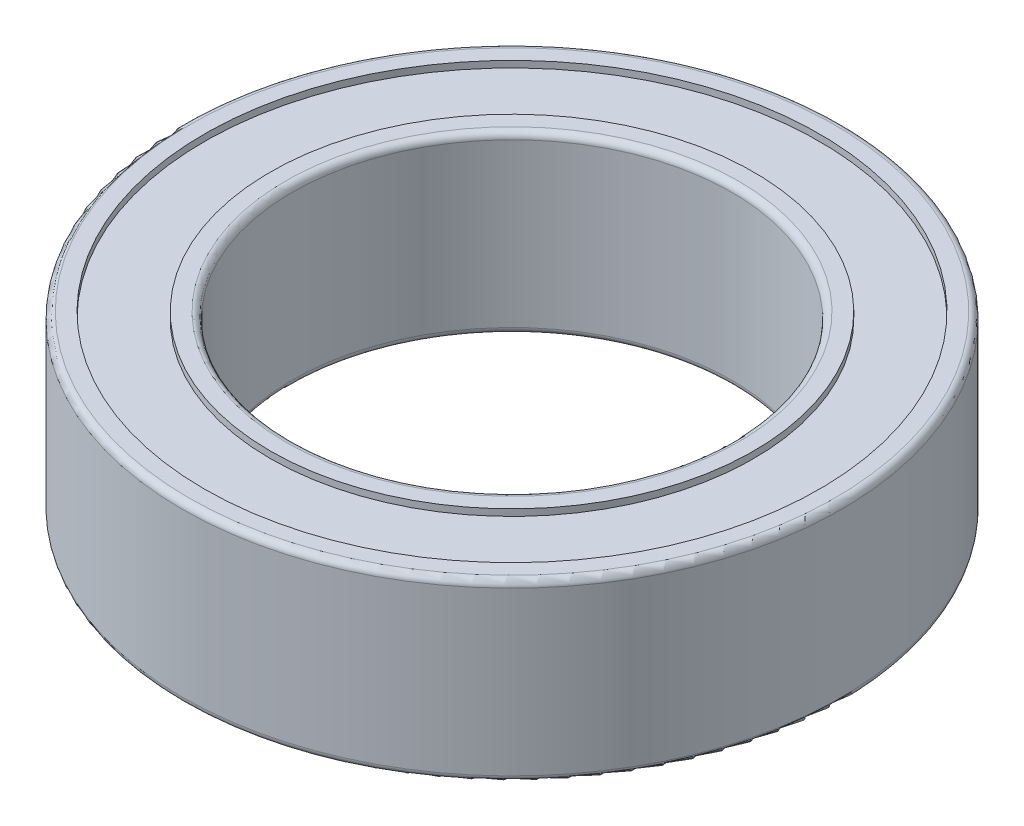
ISO-10303-21;
HEADER;
FILE_DESCRIPTION(('STEP AP214'),'2;1');
FILE_NAME('part.step','',(''),(''),'','','');
FILE_SCHEMA(('AUTOMOTIVE_DESIGN { 1 0 10303 214 1 1 1 1 }'));
ENDSEC;
DATA;
#1=APPLICATION_CONTEXT('core data for automotive mechanical design processes');
#2=APPLICATION_PROTOCOL_DEFINITION('international standard','automotive_design',2000,#1);
#3=PRODUCT_CONTEXT('',#1,'mechanical');
#4=PRODUCT('Part','Part','',(#3));
#5=PRODUCT_RELATED_PRODUCT_CATEGORY('part','',(#4));
#6=PRODUCT_DEFINITION_FORMATION('','',#4);
#7=PRODUCT_DEFINITION_CONTEXT('part definition',#1,'design');
#8=PRODUCT_DEFINITION('design','',#6,#7);
#9=PRODUCT_DEFINITION_SHAPE('','',#8);
#10=(LENGTH_UNIT() NAMED_UNIT(*) SI_UNIT(.MILLI.,.METRE.));
#11=(NAMED_UNIT(*) PLANE_ANGLE_UNIT() SI_UNIT($,.RADIAN.));
#12=(NAMED_UNIT(*) SI_UNIT($,.STERADIAN.) SOLID_ANGLE_UNIT());
#13=UNCERTAINTY_MEASURE_WITH_UNIT(LENGTH_MEASURE(1.E-05),#10,'distance_accuracy_value','');
#14=(GEOMETRIC_REPRESENTATION_CONTEXT(3) GLOBAL_UNCERTAINTY_ASSIGNED_CONTEXT((#13)) GLOBAL_UNIT_ASSIGNED_CONTEXT((#10,
#11,#12)) REPRESENTATION_CONTEXT('',''));
#15=CARTESIAN_POINT('',(0.,0.,0.));
#16=DIRECTION('',(0.,0.,1.));
#17=DIRECTION('',(1.,0.,0.));
#18=AXIS2_PLACEMENT_3D('',#15,#16,#17);
#19=CARTESIAN_POINT('',(0.,-1.85,0.));
#20=DIRECTION('',(0.,1.,0.));
#21=DIRECTION('',(0.,0.,1.));
#22=AXIS2_PLACEMENT_3D('',#19,#20,#21);
#23=TOROIDAL_SURFACE('',#22,5.15,0.15);
#24=CARTESIAN_POINT('',(0.,-1.85,0.));
#25=DIRECTION('',(0.,1.,0.));
#26=DIRECTION('',(0.,0.,1.));
#27=AXIS2_PLACEMENT_3D('',#24,#25,#26);
#28=CIRCLE('',#27,5.);
#29=CARTESIAN_POINT('',(0.,-1.85,5.));
#30=VERTEX_POINT('',#29);
#31=EDGE_CURVE('E10',#30,#30,#28,.T.);
#32=ORIENTED_EDGE('',*,*,#31,.T.);
#33=EDGE_LOOP('',(#32));
#34=FACE_BOUND('',#33,.T.);
#35=CARTESIAN_POINT('',(0.,-2.,0.));
#36=DIRECTION('',(0.,1.,0.));
#37=DIRECTION('',(0.,0.,1.));
#38=AXIS2_PLACEMENT_3D('',#35,#36,#37);
#39=CIRCLE('',#38,5.15);
#40=CARTESIAN_POINT('',(0.,-2.,5.15));
#41=VERTEX_POINT('',#40);
#42=EDGE_CURVE('E84',#41,#41,#39,.T.);
#43=ORIENTED_EDGE('',*,*,#42,.F.);
#44=EDGE_LOOP('',(#43));
#45=FACE_BOUND('',#44,.T.);
#46=ADVANCED_FACE('F32',(#34,#45),#23,.T.);
#47=CARTESIAN_POINT('',(0.,-2.00303108696888,0.));
#48=DIRECTION('',(0.,1.,0.));
#49=DIRECTION('',(0.,0.,1.));
#50=AXIS2_PLACEMENT_3D('',#47,#48,#49);
#51=CYLINDRICAL_SURFACE('',#50,5.);
#52=CARTESIAN_POINT('',(0.,1.85,0.));
#53=DIRECTION('',(0.,1.,0.));
#54=DIRECTION('',(0.,0.,1.));
#55=AXIS2_PLACEMENT_3D('',#52,#53,#54);
#56=CIRCLE('',#55,5.);
#57=CARTESIAN_POINT('',(0.,1.85,5.));
#58=VERTEX_POINT('',#57);
#59=EDGE_CURVE('E38',#58,#58,#56,.T.);
#60=ORIENTED_EDGE('',*,*,#59,.T.);
#61=EDGE_LOOP('',(#60));
#62=FACE_BOUND('',#61,.T.);
#63=ORIENTED_EDGE('',*,*,#31,.F.);
#64=EDGE_LOOP('',(#63));
#65=FACE_BOUND('',#64,.T.);
#66=ADVANCED_FACE('F92',(#62,#65),#51,.F.);
#67=CARTESIAN_POINT('',(0.,1.85,0.));
#68=DIRECTION('',(0.,1.,0.));
#69=DIRECTION('',(0.,0.,1.));
#70=AXIS2_PLACEMENT_3D('',#67,#68,#69);
#71=TOROIDAL_SURFACE('',#70,5.15,0.15);
#72=CARTESIAN_POINT('',(0.,2.,0.));
#73=DIRECTION('',(0.,1.,0.));
#74=DIRECTION('',(0.,0.,1.));
#75=AXIS2_PLACEMENT_3D('',#72,#73,#74);
#76=CIRCLE('',#75,5.15);
#77=CARTESIAN_POINT('',(0.,2.,5.15));
#78=VERTEX_POINT('',#77);
#79=EDGE_CURVE('E42',#78,#78,#76,.T.);
#80=ORIENTED_EDGE('',*,*,#79,.T.);
#81=EDGE_LOOP('',(#80));
#82=FACE_BOUND('',#81,.T.);
#83=ORIENTED_EDGE('',*,*,#59,.F.);
#84=EDGE_LOOP('',(#83));
#85=FACE_BOUND('',#84,.T.);
#86=ADVANCED_FACE('F96',(#82,#85),#71,.T.);
#87=CARTESIAN_POINT('',(5.15,2.,0.));
#88=DIRECTION('',(0.,1.,0.));
#89=DIRECTION('',(0.,0.,1.));
#90=AXIS2_PLACEMENT_3D('',#87,#88,#89);
#91=PLANE('',#90);
#92=CARTESIAN_POINT('',(0.,2.,0.));
#93=DIRECTION('',(0.,1.,0.));
#94=DIRECTION('',(0.,0.,1.));
#95=AXIS2_PLACEMENT_3D('',#92,#93,#94);
#96=CIRCLE('',#95,5.5);
#97=CARTESIAN_POINT('',(0.,2.,5.5));
#98=VERTEX_POINT('',#97);
#99=EDGE_CURVE('E46',#98,#98,#96,.T.);
#100=ORIENTED_EDGE('',*,*,#99,.T.);
#101=EDGE_LOOP('',(#100));
#102=FACE_BOUND('',#101,.T.);
#103=ORIENTED_EDGE('',*,*,#79,.F.);
#104=EDGE_LOOP('',(#103));
#105=FACE_BOUND('',#104,.T.);
#106=ADVANCED_FACE('F100',(#102,#105),#91,.T.);
#107=CARTESIAN_POINT('',(0.,-2.00303108696888,0.));
#108=DIRECTION('',(0.,1.,0.));
#109=DIRECTION('',(0.,0.,1.));
#110=AXIS2_PLACEMENT_3D('',#107,#108,#109);
#111=CYLINDRICAL_SURFACE('',#110,5.5);
#112=CARTESIAN_POINT('',(0.,1.85,0.));
#113=DIRECTION('',(0.,1.,0.));
#114=DIRECTION('',(0.,0.,1.));
#115=AXIS2_PLACEMENT_3D('',#112,#113,#114);
#116=CIRCLE('',#115,5.5);
#117=CARTESIAN_POINT('',(0.,1.85,5.5));
#118=VERTEX_POINT('',#117);
#119=EDGE_CURVE('E51',#118,#118,#116,.T.);
#120=ORIENTED_EDGE('',*,*,#119,.T.);
#121=EDGE_LOOP('',(#120));
#122=FACE_BOUND('',#121,.T.);
#123=ORIENTED_EDGE('',*,*,#99,.F.);
#124=EDGE_LOOP('',(#123));
#125=FACE_BOUND('',#124,.T.);
#126=ADVANCED_FACE('F107',(#122,#125),#111,.T.);
#127=CARTESIAN_POINT('',(5.5,1.85,0.));
#128=DIRECTION('',(0.,1.,0.));
#129=DIRECTION('',(0.,0.,1.));
#130=AXIS2_PLACEMENT_3D('',#127,#128,#129);
#131=PLANE('',#130);
#132=CARTESIAN_POINT('',(0.,1.85,0.));
#133=DIRECTION('',(0.,1.,0.));
#134=DIRECTION('',(0.,0.,1.));
#135=AXIS2_PLACEMENT_3D('',#132,#133,#134);
#136=CIRCLE('',#135,7.);
#137=CARTESIAN_POINT('',(0.,1.85,7.));
#138=VERTEX_POINT('',#137);
#139=EDGE_CURVE('E54',#138,#138,#136,.T.);
#140=ORIENTED_EDGE('',*,*,#139,.T.);
#141=EDGE_LOOP('',(#140));
#142=FACE_BOUND('',#141,.T.);
#143=ORIENTED_EDGE('',*,*,#119,.F.);
#144=EDGE_LOOP('',(#143));
#145=FACE_BOUND('',#144,.T.);
#146=ADVANCED_FACE('F111',(#142,#145),#131,.T.);
#147=CARTESIAN_POINT('',(0.,-2.00303108696888,0.));
#148=DIRECTION('',(0.,1.,0.));
#149=DIRECTION('',(0.,0.,1.));
#150=AXIS2_PLACEMENT_3D('',#147,#148,#149);
#151=CYLINDRICAL_SURFACE('',#150,7.);
#152=CARTESIAN_POINT('',(0.,2.,0.));
#153=DIRECTION('',(0.,1.,0.));
#154=DIRECTION('',(0.,0.,1.));
#155=AXIS2_PLACEMENT_3D('',#152,#153,#154);
#156=CIRCLE('',#155,7.);
#157=CARTESIAN_POINT('',(0.,2.,7.));
#158=VERTEX_POINT('',#157);
#159=EDGE_CURVE('E57',#158,#158,#156,.T.);
#160=ORIENTED_EDGE('',*,*,#159,.T.);
#161=EDGE_LOOP('',(#160));
#162=FACE_BOUND('',#161,.T.);
#163=ORIENTED_EDGE('',*,*,#139,.F.);
#164=EDGE_LOOP('',(#163));
#165=FACE_BOUND('',#164,.T.);
#166=ADVANCED_FACE('F115',(#162,#165),#151,.F.);
#167=CARTESIAN_POINT('',(7.,2.,0.));
#168=DIRECTION('',(0.,1.,0.));
#169=DIRECTION('',(0.,0.,1.));
#170=AXIS2_PLACEMENT_3D('',#167,#168,#169);
#171=PLANE('',#170);
#172=CARTESIAN_POINT('',(0.,2.,0.));
#173=DIRECTION('',(0.,1.,0.));
#174=DIRECTION('',(0.,0.,1.));
#175=AXIS2_PLACEMENT_3D('',#172,#173,#174);
#176=CIRCLE('',#175,7.35000000000007);
#177=CARTESIAN_POINT('',(0.,2.,7.35000000000007));
#178=VERTEX_POINT('',#177);
#179=EDGE_CURVE('E60',#178,#178,#176,.T.);
#180=ORIENTED_EDGE('',*,*,#179,.T.);
#181=EDGE_LOOP('',(#180));
#182=FACE_BOUND('',#181,.T.);
#183=ORIENTED_EDGE('',*,*,#159,.F.);
#184=EDGE_LOOP('',(#183));
#185=FACE_BOUND('',#184,.T.);
#186=ADVANCED_FACE('F119',(#182,#185),#171,.T.);
#187=CARTESIAN_POINT('',(0.,1.85,0.));
#188=DIRECTION('',(0.,1.,0.));
#189=DIRECTION('',(0.,0.,1.));
#190=AXIS2_PLACEMENT_3D('',#187,#188,#189);
#191=TOROIDAL_SURFACE('',#190,7.35,0.15);
#192=CARTESIAN_POINT('',(0.,1.85,0.));
#193=DIRECTION('',(0.,1.,0.));
#194=DIRECTION('',(0.,0.,1.));
#195=AXIS2_PLACEMENT_3D('',#192,#193,#194);
#196=CIRCLE('',#195,7.5);
#197=CARTESIAN_POINT('',(0.,1.85,7.5));
#198=VERTEX_POINT('',#197);
#199=EDGE_CURVE('E63',#198,#198,#196,.T.);
#200=ORIENTED_EDGE('',*,*,#199,.T.);
#201=EDGE_LOOP('',(#200));
#202=FACE_BOUND('',#201,.T.);
#203=ORIENTED_EDGE('',*,*,#179,.F.);
#204=EDGE_LOOP('',(#203));
#205=FACE_BOUND('',#204,.T.);
#206=ADVANCED_FACE('F123',(#202,#205),#191,.T.);
#207=CARTESIAN_POINT('',(0.,-2.00303108696888,0.));
#208=DIRECTION('',(0.,1.,0.));
#209=DIRECTION('',(0.,0.,1.));
#210=AXIS2_PLACEMENT_3D('',#207,#208,#209);
#211=CYLINDRICAL_SURFACE('',#210,7.5);
#212=CARTESIAN_POINT('',(0.,-1.85,0.));
#213=DIRECTION('',(0.,1.,0.));
#214=DIRECTION('',(0.,0.,1.));
#215=AXIS2_PLACEMENT_3D('',#212,#213,#214);
#216=CIRCLE('',#215,7.5);
#217=CARTESIAN_POINT('',(0.,-1.85,7.5));
#218=VERTEX_POINT('',#217);
#219=EDGE_CURVE('E66',#218,#218,#216,.T.);
#220=ORIENTED_EDGE('',*,*,#219,.T.);
#221=EDGE_LOOP('',(#220));
#222=FACE_BOUND('',#221,.T.);
#223=ORIENTED_EDGE('',*,*,#199,.F.);
#224=EDGE_LOOP('',(#223));
#225=FACE_BOUND('',#224,.T.);
#226=ADVANCED_FACE('F127',(#222,#225),#211,.T.);
#227=CARTESIAN_POINT('',(0.,-1.85,0.));
#228=DIRECTION('',(0.,1.,0.));
#229=DIRECTION('',(0.,0.,1.));
#230=AXIS2_PLACEMENT_3D('',#227,#228,#229);
#231=TOROIDAL_SURFACE('',#230,7.35,0.15);
#232=CARTESIAN_POINT('',(0.,-2.,0.));
#233=DIRECTION('',(0.,1.,0.));
#234=DIRECTION('',(0.,0.,1.));
#235=AXIS2_PLACEMENT_3D('',#232,#233,#234);
#236=CIRCLE('',#235,7.35);
#237=CARTESIAN_POINT('',(0.,-2.,7.35));
#238=VERTEX_POINT('',#237);
#239=EDGE_CURVE('E69',#238,#238,#236,.T.);
#240=ORIENTED_EDGE('',*,*,#239,.T.);
#241=EDGE_LOOP('',(#240));
#242=FACE_BOUND('',#241,.T.);
#243=ORIENTED_EDGE('',*,*,#219,.F.);
#244=EDGE_LOOP('',(#243));
#245=FACE_BOUND('',#244,.T.);
#246=ADVANCED_FACE('F131',(#242,#245),#231,.T.);
#247=CARTESIAN_POINT('',(7.35,-2.,0.));
#248=DIRECTION('',(0.,-1.,0.));
#249=DIRECTION('',(0.,0.,-1.));
#250=AXIS2_PLACEMENT_3D('',#247,#248,#249);
#251=PLANE('',#250);
#252=CARTESIAN_POINT('',(0.,-2.,0.));
#253=DIRECTION('',(0.,1.,0.));
#254=DIRECTION('',(0.,0.,1.));
#255=AXIS2_PLACEMENT_3D('',#252,#253,#254);
#256=CIRCLE('',#255,7.);
#257=CARTESIAN_POINT('',(0.,-2.,7.));
#258=VERTEX_POINT('',#257);
#259=EDGE_CURVE('E72',#258,#258,#256,.T.);
#260=ORIENTED_EDGE('',*,*,#259,.T.);
#261=EDGE_LOOP('',(#260));
#262=FACE_BOUND('',#261,.T.);
#263=ORIENTED_EDGE('',*,*,#239,.F.);
#264=EDGE_LOOP('',(#263));
#265=FACE_BOUND('',#264,.T.);
#266=ADVANCED_FACE('F135',(#262,#265),#251,.T.);
#267=CARTESIAN_POINT('',(0.,-2.00303108696888,0.));
#268=DIRECTION('',(0.,1.,0.));
#269=DIRECTION('',(0.,0.,1.));
#270=AXIS2_PLACEMENT_3D('',#267,#268,#269);
#271=CYLINDRICAL_SURFACE('',#270,7.);
#272=CARTESIAN_POINT('',(0.,-1.85,0.));
#273=DIRECTION('',(0.,1.,0.));
#274=DIRECTION('',(0.,0.,1.));
#275=AXIS2_PLACEMENT_3D('',#272,#273,#274);
#276=CIRCLE('',#275,7.);
#277=CARTESIAN_POINT('',(0.,-1.85,7.));
#278=VERTEX_POINT('',#277);
#279=EDGE_CURVE('E75',#278,#278,#276,.T.);
#280=ORIENTED_EDGE('',*,*,#279,.T.);
#281=EDGE_LOOP('',(#280));
#282=FACE_BOUND('',#281,.T.);
#283=ORIENTED_EDGE('',*,*,#259,.F.);
#284=EDGE_LOOP('',(#283));
#285=FACE_BOUND('',#284,.T.);
#286=ADVANCED_FACE('F139',(#282,#285),#271,.F.);
#287=CARTESIAN_POINT('',(7.,-1.85,0.));
#288=DIRECTION('',(0.,-1.,0.));
#289=DIRECTION('',(0.,0.,-1.));
#290=AXIS2_PLACEMENT_3D('',#287,#288,#289);
#291=PLANE('',#290);
#292=CARTESIAN_POINT('',(0.,-1.85,0.));
#293=DIRECTION('',(0.,1.,0.));
#294=DIRECTION('',(0.,0.,1.));
#295=AXIS2_PLACEMENT_3D('',#292,#293,#294);
#296=CIRCLE('',#295,5.5);
#297=CARTESIAN_POINT('',(0.,-1.85,5.5));
#298=VERTEX_POINT('',#297);
#299=EDGE_CURVE('E78',#298,#298,#296,.T.);
#300=ORIENTED_EDGE('',*,*,#299,.T.);
#301=EDGE_LOOP('',(#300));
#302=FACE_BOUND('',#301,.T.);
#303=ORIENTED_EDGE('',*,*,#279,.F.);
#304=EDGE_LOOP('',(#303));
#305=FACE_BOUND('',#304,.T.);
#306=ADVANCED_FACE('F143',(#302,#305),#291,.T.);
#307=CARTESIAN_POINT('',(0.,-2.00303108696888,0.));
#308=DIRECTION('',(0.,1.,0.));
#309=DIRECTION('',(0.,0.,1.));
#310=AXIS2_PLACEMENT_3D('',#307,#308,#309);
#311=CYLINDRICAL_SURFACE('',#310,5.5);
#312=CARTESIAN_POINT('',(0.,-2.,0.));
#313=DIRECTION('',(0.,1.,0.));
#314=DIRECTION('',(0.,0.,1.));
#315=AXIS2_PLACEMENT_3D('',#312,#313,#314);
#316=CIRCLE('',#315,5.5);
#317=CARTESIAN_POINT('',(0.,-2.,5.5));
#318=VERTEX_POINT('',#317);
#319=EDGE_CURVE('E81',#318,#318,#316,.T.);
#320=ORIENTED_EDGE('',*,*,#319,.T.);
#321=EDGE_LOOP('',(#320));
#322=FACE_BOUND('',#321,.T.);
#323=ORIENTED_EDGE('',*,*,#299,.F.);
#324=EDGE_LOOP('',(#323));
#325=FACE_BOUND('',#324,.T.);
#326=ADVANCED_FACE('F147',(#322,#325),#311,.T.);
#327=CARTESIAN_POINT('',(5.5,-2.,0.));
#328=DIRECTION('',(0.,-1.,0.));
#329=DIRECTION('',(0.,0.,-1.));
#330=AXIS2_PLACEMENT_3D('',#327,#328,#329);
#331=PLANE('',#330);
#332=ORIENTED_EDGE('',*,*,#42,.T.);
#333=EDGE_LOOP('',(#332));
#334=FACE_BOUND('',#333,.T.);
#335=ORIENTED_EDGE('',*,*,#319,.F.);
#336=EDGE_LOOP('',(#335));
#337=FACE_BOUND('',#336,.T.);
#338=ADVANCED_FACE('F88',(#334,#337),#331,.T.);
#339=CLOSED_SHELL('',(#46,#66,#86,#106,#126,#146,#166,#186,#206,#226,#246,#266,#286,#306,#326,#338));
#340=MANIFOLD_SOLID_BREP('B2',#339);
#341=ADVANCED_BREP_SHAPE_REPRESENTATION('',(#18,#340),#14);
#342=SHAPE_DEFINITION_REPRESENTATION(#9,#341);
ENDSEC;
END-ISO-10303-21;
